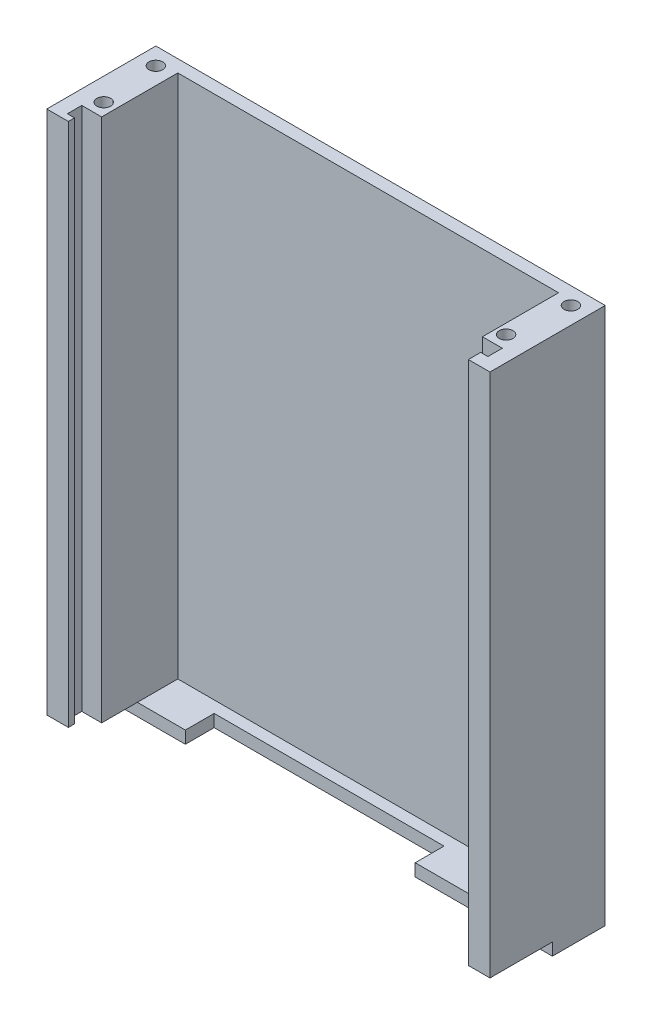
ISO-10303-21;
HEADER;
FILE_DESCRIPTION(('STEP AP214'),'2;1');
FILE_NAME('part.step','',(''),(''),'','','');
FILE_SCHEMA(('AUTOMOTIVE_DESIGN { 1 0 10303 214 1 1 1 1 }'));
ENDSEC;
DATA;
#1=APPLICATION_CONTEXT('core data for automotive mechanical design processes');
#2=APPLICATION_PROTOCOL_DEFINITION('international standard','automotive_design',2000,#1);
#3=PRODUCT_CONTEXT('',#1,'mechanical');
#4=PRODUCT('Part','Part','',(#3));
#5=PRODUCT_RELATED_PRODUCT_CATEGORY('part','',(#4));
#6=PRODUCT_DEFINITION_FORMATION('','',#4);
#7=PRODUCT_DEFINITION_CONTEXT('part definition',#1,'design');
#8=PRODUCT_DEFINITION('design','',#6,#7);
#9=PRODUCT_DEFINITION_SHAPE('','',#8);
#10=(LENGTH_UNIT() NAMED_UNIT(*) SI_UNIT(.MILLI.,.METRE.));
#11=(NAMED_UNIT(*) PLANE_ANGLE_UNIT() SI_UNIT($,.RADIAN.));
#12=(NAMED_UNIT(*) SI_UNIT($,.STERADIAN.) SOLID_ANGLE_UNIT());
#13=UNCERTAINTY_MEASURE_WITH_UNIT(LENGTH_MEASURE(1.E-05),#10,'distance_accuracy_value','');
#14=(GEOMETRIC_REPRESENTATION_CONTEXT(3) GLOBAL_UNCERTAINTY_ASSIGNED_CONTEXT((#13)) GLOBAL_UNIT_ASSIGNED_CONTEXT((#10,
#11,#12)) REPRESENTATION_CONTEXT('',''));
#15=CARTESIAN_POINT('',(0.,0.,0.));
#16=DIRECTION('',(0.,0.,1.));
#17=DIRECTION('',(1.,0.,0.));
#18=AXIS2_PLACEMENT_3D('',#15,#16,#17);
#19=CARTESIAN_POINT('',(0.,0.,0.));
#20=DIRECTION('',(0.,0.,1.));
#21=DIRECTION('',(1.,0.,0.));
#22=AXIS2_PLACEMENT_3D('',#19,#20,#21);
#23=PLANE('',#22);
#24=DIRECTION('',(0.,-1.,0.));
#25=VECTOR('',#24,1.);
#26=CARTESIAN_POINT('',(-54.2865384615385,7.1576923076923,0.));
#27=LINE('',#26,#25);
#28=CARTESIAN_POINT('',(-54.2865384615385,7.1576923076923,0.));
#29=VERTEX_POINT('',#28);
#30=CARTESIAN_POINT('',(-54.2865384615385,-15.8423076923077,0.));
#31=VERTEX_POINT('',#30);
#32=EDGE_CURVE('E214',#29,#31,#27,.T.);
#33=ORIENTED_EDGE('',*,*,#32,.F.);
#34=DIRECTION('',(1.,0.,0.));
#35=VECTOR('',#34,1.);
#36=CARTESIAN_POINT('',(-51.2865384615384,7.1576923076923,0.));
#37=LINE('',#36,#35);
#38=CARTESIAN_POINT('',(-62.1365384615385,7.1576923076923,0.));
#39=VERTEX_POINT('',#38);
#40=EDGE_CURVE('E218',#39,#29,#37,.T.);
#41=ORIENTED_EDGE('',*,*,#40,.F.);
#42=DIRECTION('',(0.,-1.,0.));
#43=VECTOR('',#42,1.);
#44=CARTESIAN_POINT('',(-62.1365384615385,7.1576923076923,0.));
#45=LINE('',#44,#43);
#46=CARTESIAN_POINT('',(-62.1365384615385,-15.8423076923077,0.));
#47=VERTEX_POINT('',#46);
#48=EDGE_CURVE('E643',#39,#47,#45,.T.);
#49=ORIENTED_EDGE('',*,*,#48,.T.);
#50=DIRECTION('',(-1.,0.,0.));
#51=VECTOR('',#50,1.);
#52=CARTESIAN_POINT('',(-51.2865384615384,-15.8423076923077,0.));
#53=LINE('',#52,#51);
#54=EDGE_CURVE('E220',#31,#47,#53,.T.);
#55=ORIENTED_EDGE('',*,*,#54,.F.);
#56=EDGE_LOOP('',(#33,#41,#49,#55));
#57=FACE_BOUND('',#56,.T.);
#58=DIRECTION('',(0.,-1.,0.));
#59=VECTOR('',#58,1.);
#60=CARTESIAN_POINT('',(-90.9615384615384,34.8076923076923,0.));
#61=LINE('',#60,#59);
#62=CARTESIAN_POINT('',(-90.9615384615384,34.8076923076923,0.));
#63=VERTEX_POINT('',#62);
#64=CARTESIAN_POINT('',(-90.9615384615384,-43.4923076923077,0.));
#65=VERTEX_POINT('',#64);
#66=EDGE_CURVE('E392',#63,#65,#61,.T.);
#67=ORIENTED_EDGE('',*,*,#66,.F.);
#68=DIRECTION('',(-1.,0.,0.));
#69=VECTOR('',#68,1.);
#70=CARTESIAN_POINT('',(-90.9615384615384,34.8076923076923,0.));
#71=LINE('',#70,#69);
#72=CARTESIAN_POINT('',(-25.4615384615384,34.8076923076923,0.));
#73=VERTEX_POINT('',#72);
#74=EDGE_CURVE('E396',#73,#63,#71,.T.);
#75=ORIENTED_EDGE('',*,*,#74,.F.);
#76=DIRECTION('',(0.,1.,0.));
#77=VECTOR('',#76,1.);
#78=CARTESIAN_POINT('',(-25.4615384615384,34.8076923076923,0.));
#79=LINE('',#78,#77);
#80=CARTESIAN_POINT('',(-25.4615384615384,-43.4923076923077,0.));
#81=VERTEX_POINT('',#80);
#82=EDGE_CURVE('E401',#81,#73,#79,.T.);
#83=ORIENTED_EDGE('',*,*,#82,.F.);
#84=DIRECTION('',(1.,0.,0.));
#85=VECTOR('',#84,1.);
#86=CARTESIAN_POINT('',(-90.9615384615384,-43.4923076923077,0.));
#87=LINE('',#86,#85);
#88=EDGE_CURVE('E250',#65,#81,#87,.T.);
#89=ORIENTED_EDGE('',*,*,#88,.F.);
#90=EDGE_LOOP('',(#67,#75,#83,#89));
#91=FACE_BOUND('',#90,.T.);
#92=ADVANCED_FACE('F33',(#57,#91),#23,.F.);
#93=CARTESIAN_POINT('',(-90.9615384615384,-41.6923076923077,1.8));
#94=DIRECTION('',(0.,1.,0.));
#95=DIRECTION('',(0.,0.,1.));
#96=AXIS2_PLACEMENT_3D('',#93,#94,#95);
#97=PLANE('',#96);
#98=CARTESIAN_POINT('',(-87.6615384615384,-41.6923076923077,10.9));
#99=DIRECTION('',(0.,-1.,0.));
#100=DIRECTION('',(0.,0.,-1.));
#101=AXIS2_PLACEMENT_3D('',#98,#99,#100);
#102=CIRCLE('',#101,0.999999999999998);
#103=CARTESIAN_POINT('',(-87.6615384615384,-41.6923076923077,9.9));
#104=VERTEX_POINT('',#103);
#105=EDGE_CURVE('E635',#104,#104,#102,.T.);
#106=ORIENTED_EDGE('',*,*,#105,.F.);
#107=EDGE_LOOP('',(#106));
#108=FACE_BOUND('',#107,.T.);
#109=DIRECTION('',(-1.,0.,0.));
#110=VECTOR('',#109,1.);
#111=CARTESIAN_POINT('',(-85.9615384615384,-41.6923076923077,7.7));
#112=LINE('',#111,#110);
#113=CARTESIAN_POINT('',(-85.9615384615384,-41.6923076923077,7.7));
#114=VERTEX_POINT('',#113);
#115=CARTESIAN_POINT('',(-90.9615384615384,-41.6923076923077,7.7));
#116=VERTEX_POINT('',#115);
#117=EDGE_CURVE('E11',#114,#116,#112,.T.);
#118=ORIENTED_EDGE('',*,*,#117,.F.);
#119=DIRECTION('',(0.,0.,-1.));
#120=VECTOR('',#119,1.);
#121=CARTESIAN_POINT('',(-85.9615384615384,-41.6923076923077,16.8));
#122=LINE('',#121,#120);
#123=CARTESIAN_POINT('',(-85.9615384615384,-41.6923076923077,12.9));
#124=VERTEX_POINT('',#123);
#125=EDGE_CURVE('E389',#124,#114,#122,.T.);
#126=ORIENTED_EDGE('',*,*,#125,.F.);
#127=DIRECTION('',(1.,0.,0.));
#128=VECTOR('',#127,1.);
#129=CARTESIAN_POINT('',(-88.8615384615384,-41.6923076923077,12.9));
#130=LINE('',#129,#128);
#131=CARTESIAN_POINT('',(-88.8615384615384,-41.6923076923077,12.9));
#132=VERTEX_POINT('',#131);
#133=EDGE_CURVE('E296',#132,#124,#130,.T.);
#134=ORIENTED_EDGE('',*,*,#133,.F.);
#135=DIRECTION('',(0.,0.,-1.));
#136=VECTOR('',#135,1.);
#137=CARTESIAN_POINT('',(-88.8615384615384,-41.6923076923077,12.9));
#138=LINE('',#137,#136);
#139=CARTESIAN_POINT('',(-88.8615384615384,-41.6923076923077,15.));
#140=VERTEX_POINT('',#139);
#141=EDGE_CURVE('E319',#140,#132,#138,.T.);
#142=ORIENTED_EDGE('',*,*,#141,.F.);
#143=DIRECTION('',(-1.,0.,0.));
#144=VECTOR('',#143,1.);
#145=CARTESIAN_POINT('',(-88.8615384615384,-41.6923076923077,15.));
#146=LINE('',#145,#144);
#147=CARTESIAN_POINT('',(-87.8115384615384,-41.6923076923077,15.));
#148=VERTEX_POINT('',#147);
#149=EDGE_CURVE('E316',#148,#140,#146,.T.);
#150=ORIENTED_EDGE('',*,*,#149,.F.);
#151=DIRECTION('',(0.,0.,-1.));
#152=VECTOR('',#151,1.);
#153=CARTESIAN_POINT('',(-87.8115384615384,-41.6923076923077,15.9));
#154=LINE('',#153,#152);
#155=CARTESIAN_POINT('',(-87.8115384615384,-41.6923076923077,15.9));
#156=VERTEX_POINT('',#155);
#157=EDGE_CURVE('E312',#156,#148,#154,.T.);
#158=ORIENTED_EDGE('',*,*,#157,.F.);
#159=DIRECTION('',(1.,0.,0.));
#160=VECTOR('',#159,1.);
#161=CARTESIAN_POINT('',(-89.1115384615384,-41.6923076923077,15.9));
#162=LINE('',#161,#160);
#163=CARTESIAN_POINT('',(-90.9615384615384,-41.6923076923077,15.9));
#164=VERTEX_POINT('',#163);
#165=EDGE_CURVE('E309',#164,#156,#162,.T.);
#166=ORIENTED_EDGE('',*,*,#165,.F.);
#167=DIRECTION('',(0.,0.,-1.));
#168=VECTOR('',#167,1.);
#169=CARTESIAN_POINT('',(-90.9615384615384,-41.6923076923077,1.8));
#170=LINE('',#169,#168);
#171=EDGE_CURVE('E37',#164,#116,#170,.T.);
#172=ORIENTED_EDGE('',*,*,#171,.T.);
#173=EDGE_LOOP('',(#118,#126,#134,#142,#150,#158,#166,#172));
#174=FACE_BOUND('',#173,.T.);
#175=ADVANCED_FACE('F460',(#108,#174),#97,.F.);
#176=CARTESIAN_POINT('',(-29.0115384615384,-41.6923076923077,10.9));
#177=DIRECTION('',(0.,-1.,0.));
#178=DIRECTION('',(0.,0.,-1.));
#179=AXIS2_PLACEMENT_3D('',#176,#177,#178);
#180=CIRCLE('',#179,1.);
#181=CARTESIAN_POINT('',(-29.0115384615384,-41.6923076923077,9.9));
#182=VERTEX_POINT('',#181);
#183=EDGE_CURVE('E625',#182,#182,#180,.T.);
#184=ORIENTED_EDGE('',*,*,#183,.F.);
#185=EDGE_LOOP('',(#184));
#186=FACE_BOUND('',#185,.T.);
#187=DIRECTION('',(-1.,0.,0.));
#188=VECTOR('',#187,1.);
#189=CARTESIAN_POINT('',(-30.4615384615384,-41.6923076923077,7.7));
#190=LINE('',#189,#188);
#191=CARTESIAN_POINT('',(-25.4615384615384,-41.6923076923077,7.69999999999999));
#192=VERTEX_POINT('',#191);
#193=CARTESIAN_POINT('',(-30.4615384615384,-41.6923076923077,7.7));
#194=VERTEX_POINT('',#193);
#195=EDGE_CURVE('E50',#192,#194,#190,.T.);
#196=ORIENTED_EDGE('',*,*,#195,.F.);
#197=DIRECTION('',(0.,0.,-1.));
#198=VECTOR('',#197,1.);
#199=CARTESIAN_POINT('',(-25.4615384615384,-41.6923076923077,1.8));
#200=LINE('',#199,#198);
#201=CARTESIAN_POINT('',(-25.4615384615384,-41.6923076923077,16.8));
#202=VERTEX_POINT('',#201);
#203=EDGE_CURVE('E408',#202,#192,#200,.T.);
#204=ORIENTED_EDGE('',*,*,#203,.F.);
#205=DIRECTION('',(1.,0.,0.));
#206=VECTOR('',#205,1.);
#207=CARTESIAN_POINT('',(-25.4615384615384,-41.6923076923077,16.8));
#208=LINE('',#207,#206);
#209=CARTESIAN_POINT('',(-28.6115384615384,-41.6923076923077,16.8));
#210=VERTEX_POINT('',#209);
#211=EDGE_CURVE('E374',#210,#202,#208,.T.);
#212=ORIENTED_EDGE('',*,*,#211,.F.);
#213=DIRECTION('',(0.,0.,1.));
#214=VECTOR('',#213,1.);
#215=CARTESIAN_POINT('',(-28.6115384615384,-41.6923076923077,15.9));
#216=LINE('',#215,#214);
#217=CARTESIAN_POINT('',(-28.6115384615384,-41.6923076923077,15.));
#218=VERTEX_POINT('',#217);
#219=EDGE_CURVE('E352',#218,#210,#216,.T.);
#220=ORIENTED_EDGE('',*,*,#219,.F.);
#221=DIRECTION('',(-1.,0.,0.));
#222=VECTOR('',#221,1.);
#223=CARTESIAN_POINT('',(-28.6115384615384,-41.6923076923077,15.));
#224=LINE('',#223,#222);
#225=CARTESIAN_POINT('',(-27.5615384615384,-41.6923076923077,15.));
#226=VERTEX_POINT('',#225);
#227=EDGE_CURVE('E291',#226,#218,#224,.T.);
#228=ORIENTED_EDGE('',*,*,#227,.F.);
#229=DIRECTION('',(0.,0.,1.));
#230=VECTOR('',#229,1.);
#231=CARTESIAN_POINT('',(-27.5615384615384,-41.6923076923077,15.));
#232=LINE('',#231,#230);
#233=CARTESIAN_POINT('',(-27.5615384615384,-41.6923076923077,12.9));
#234=VERTEX_POINT('',#233);
#235=EDGE_CURVE('E340',#234,#226,#232,.T.);
#236=ORIENTED_EDGE('',*,*,#235,.F.);
#237=DIRECTION('',(1.,0.,0.));
#238=VECTOR('',#237,1.);
#239=CARTESIAN_POINT('',(-27.5615384615384,-41.6923076923077,12.9));
#240=LINE('',#239,#238);
#241=CARTESIAN_POINT('',(-30.4615384615384,-41.6923076923077,12.9));
#242=VERTEX_POINT('',#241);
#243=EDGE_CURVE('E354',#242,#234,#240,.T.);
#244=ORIENTED_EDGE('',*,*,#243,.F.);
#245=DIRECTION('',(0.,0.,-1.));
#246=VECTOR('',#245,1.);
#247=CARTESIAN_POINT('',(-30.4615384615384,-41.6923076923077,16.8));
#248=LINE('',#247,#246);
#249=EDGE_CURVE('E379',#242,#194,#248,.T.);
#250=ORIENTED_EDGE('',*,*,#249,.T.);
#251=EDGE_LOOP('',(#196,#204,#212,#220,#228,#236,#244,#250));
#252=FACE_BOUND('',#251,.T.);
#253=ADVANCED_FACE('F462',(#186,#252),#97,.F.);
#254=CARTESIAN_POINT('',(0.,0.,1.8));
#255=DIRECTION('',(0.,0.,1.));
#256=DIRECTION('',(1.,0.,0.));
#257=AXIS2_PLACEMENT_3D('',#254,#255,#256);
#258=PLANE('',#257);
#259=DIRECTION('',(1.,0.,0.));
#260=VECTOR('',#259,1.);
#261=CARTESIAN_POINT('',(-90.9615384615384,-41.6923076923077,1.8));
#262=LINE('',#261,#260);
#263=CARTESIAN_POINT('',(-85.9615384615384,-41.6923076923077,1.8));
#264=VERTEX_POINT('',#263);
#265=CARTESIAN_POINT('',(-30.4615384615384,-41.6923076923077,1.8));
#266=VERTEX_POINT('',#265);
#267=EDGE_CURVE('E393',#264,#266,#262,.T.);
#268=ORIENTED_EDGE('',*,*,#267,.T.);
#269=DIRECTION('',(0.,-1.,0.));
#270=VECTOR('',#269,1.);
#271=CARTESIAN_POINT('',(-30.4615384615384,34.8076923076923,1.8));
#272=LINE('',#271,#270);
#273=CARTESIAN_POINT('',(-30.4615384615384,34.8076923076923,1.8));
#274=VERTEX_POINT('',#273);
#275=EDGE_CURVE('E326',#274,#266,#272,.T.);
#276=ORIENTED_EDGE('',*,*,#275,.F.);
#277=DIRECTION('',(-1.,0.,0.));
#278=VECTOR('',#277,1.);
#279=CARTESIAN_POINT('',(-90.9615384615384,34.8076923076923,1.8));
#280=LINE('',#279,#278);
#281=CARTESIAN_POINT('',(-85.9615384615384,34.8076923076923,1.8));
#282=VERTEX_POINT('',#281);
#283=EDGE_CURVE('E395',#274,#282,#280,.T.);
#284=ORIENTED_EDGE('',*,*,#283,.T.);
#285=DIRECTION('',(0.,1.,0.));
#286=VECTOR('',#285,1.);
#287=CARTESIAN_POINT('',(-85.9615384615384,34.8076923076923,1.8));
#288=LINE('',#287,#286);
#289=EDGE_CURVE('E383',#264,#282,#288,.T.);
#290=ORIENTED_EDGE('',*,*,#289,.F.);
#291=EDGE_LOOP('',(#268,#276,#284,#290));
#292=FACE_BOUND('',#291,.T.);
#293=ADVANCED_FACE('F468',(#292),#258,.T.);
#294=CARTESIAN_POINT('',(-90.9615384615384,34.8076923076923,1.8));
#295=DIRECTION('',(1.,0.,0.));
#296=DIRECTION('',(0.,1.,0.));
#297=AXIS2_PLACEMENT_3D('',#294,#295,#296);
#298=PLANE('',#297);
#299=ORIENTED_EDGE('',*,*,#171,.F.);
#300=DIRECTION('',(0.,-1.,0.));
#301=VECTOR('',#300,1.);
#302=CARTESIAN_POINT('',(-90.9615384615384,34.8076923076923,15.9));
#303=LINE('',#302,#301);
#304=CARTESIAN_POINT('',(-90.9615384615384,34.8076923076923,15.9));
#305=VERTEX_POINT('',#304);
#306=EDGE_CURVE('E308',#305,#164,#303,.T.);
#307=ORIENTED_EDGE('',*,*,#306,.F.);
#308=DIRECTION('',(0.,0.,-1.));
#309=VECTOR('',#308,1.);
#310=CARTESIAN_POINT('',(-90.9615384615384,34.8076923076923,1.8));
#311=LINE('',#310,#309);
#312=EDGE_CURVE('E399',#305,#63,#311,.T.);
#313=ORIENTED_EDGE('',*,*,#312,.T.);
#314=ORIENTED_EDGE('',*,*,#66,.T.);
#315=DIRECTION('',(0.,0.,-1.));
#316=VECTOR('',#315,1.);
#317=CARTESIAN_POINT('',(-90.9615384615384,-43.4923076923077,7.7));
#318=LINE('',#317,#316);
#319=CARTESIAN_POINT('',(-90.9615384615384,-43.4923076923077,7.7));
#320=VERTEX_POINT('',#319);
#321=EDGE_CURVE('E247',#320,#65,#318,.T.);
#322=ORIENTED_EDGE('',*,*,#321,.F.);
#323=DIRECTION('',(0.,1.,0.));
#324=VECTOR('',#323,1.);
#325=CARTESIAN_POINT('',(-90.9615384615384,-43.4923076923077,7.7));
#326=LINE('',#325,#324);
#327=EDGE_CURVE('E288',#320,#116,#326,.T.);
#328=ORIENTED_EDGE('',*,*,#327,.T.);
#329=EDGE_LOOP('',(#299,#307,#313,#314,#322,#328));
#330=FACE_BOUND('',#329,.T.);
#331=ADVANCED_FACE('F35',(#330),#298,.F.);
#332=CARTESIAN_POINT('',(-25.4615384615384,34.8076923076923,1.8));
#333=DIRECTION('',(-1.,0.,0.));
#334=DIRECTION('',(0.,-1.,0.));
#335=AXIS2_PLACEMENT_3D('',#332,#333,#334);
#336=PLANE('',#335);
#337=ORIENTED_EDGE('',*,*,#82,.T.);
#338=DIRECTION('',(0.,0.,-1.));
#339=VECTOR('',#338,1.);
#340=CARTESIAN_POINT('',(-25.4615384615384,34.8076923076923,1.8));
#341=LINE('',#340,#339);
#342=CARTESIAN_POINT('',(-25.4615384615384,34.8076923076923,16.8));
#343=VERTEX_POINT('',#342);
#344=EDGE_CURVE('E406',#343,#73,#341,.T.);
#345=ORIENTED_EDGE('',*,*,#344,.F.);
#346=DIRECTION('',(0.,1.,0.));
#347=VECTOR('',#346,1.);
#348=CARTESIAN_POINT('',(-25.4615384615384,34.8076923076923,16.8));
#349=LINE('',#348,#347);
#350=EDGE_CURVE('E368',#202,#343,#349,.T.);
#351=ORIENTED_EDGE('',*,*,#350,.F.);
#352=ORIENTED_EDGE('',*,*,#203,.T.);
#353=DIRECTION('',(0.,1.,0.));
#354=VECTOR('',#353,1.);
#355=CARTESIAN_POINT('',(-25.4615384615384,-43.4923076923077,7.7));
#356=LINE('',#355,#354);
#357=CARTESIAN_POINT('',(-25.4615384615384,-43.4923076923077,7.7));
#358=VERTEX_POINT('',#357);
#359=EDGE_CURVE('E285',#358,#192,#356,.T.);
#360=ORIENTED_EDGE('',*,*,#359,.F.);
#361=DIRECTION('',(0.,0.,1.));
#362=VECTOR('',#361,1.);
#363=CARTESIAN_POINT('',(-25.4615384615384,-43.4923076923077,0.));
#364=LINE('',#363,#362);
#365=EDGE_CURVE('E253',#81,#358,#364,.T.);
#366=ORIENTED_EDGE('',*,*,#365,.F.);
#367=EDGE_LOOP('',(#337,#345,#351,#352,#360,#366));
#368=FACE_BOUND('',#367,.T.);
#369=ADVANCED_FACE('F412',(#368),#336,.F.);
#370=CARTESIAN_POINT('',(-90.9615384615384,34.8076923076923,1.8));
#371=DIRECTION('',(0.,-1.,0.));
#372=DIRECTION('',(0.,0.,-1.));
#373=AXIS2_PLACEMENT_3D('',#370,#371,#372);
#374=PLANE('',#373);
#375=CARTESIAN_POINT('',(-27.9615384615384,34.8076923076923,2.5));
#376=DIRECTION('',(0.,1.,0.));
#377=DIRECTION('',(0.,0.,1.));
#378=AXIS2_PLACEMENT_3D('',#375,#376,#377);
#379=CIRCLE('',#378,1.);
#380=CARTESIAN_POINT('',(-27.9615384615384,34.8076923076923,3.5));
#381=VERTEX_POINT('',#380);
#382=EDGE_CURVE('E608',#381,#381,#379,.T.);
#383=ORIENTED_EDGE('',*,*,#382,.F.);
#384=EDGE_LOOP('',(#383));
#385=FACE_BOUND('',#384,.T.);
#386=CARTESIAN_POINT('',(-88.4615384615384,34.8076923076923,2.5));
#387=DIRECTION('',(0.,1.,0.));
#388=DIRECTION('',(0.,0.,1.));
#389=AXIS2_PLACEMENT_3D('',#386,#387,#388);
#390=CIRCLE('',#389,0.999999999999998);
#391=CARTESIAN_POINT('',(-88.4615384615384,34.8076923076923,3.5));
#392=VERTEX_POINT('',#391);
#393=EDGE_CURVE('E619',#392,#392,#390,.T.);
#394=ORIENTED_EDGE('',*,*,#393,.F.);
#395=EDGE_LOOP('',(#394));
#396=FACE_BOUND('',#395,.T.);
#397=CARTESIAN_POINT('',(-29.0115384615384,34.8076923076923,10.9));
#398=DIRECTION('',(0.,1.,0.));
#399=DIRECTION('',(0.,0.,1.));
#400=AXIS2_PLACEMENT_3D('',#397,#398,#399);
#401=CIRCLE('',#400,1.);
#402=CARTESIAN_POINT('',(-29.0115384615384,34.8076923076923,11.9));
#403=VERTEX_POINT('',#402);
#404=EDGE_CURVE('E626',#403,#403,#401,.T.);
#405=ORIENTED_EDGE('',*,*,#404,.F.);
#406=EDGE_LOOP('',(#405));
#407=FACE_BOUND('',#406,.T.);
#408=CARTESIAN_POINT('',(-87.6615384615384,34.8076923076923,10.9));
#409=DIRECTION('',(0.,1.,0.));
#410=DIRECTION('',(0.,0.,1.));
#411=AXIS2_PLACEMENT_3D('',#408,#409,#410);
#412=CIRCLE('',#411,0.999999999999998);
#413=CARTESIAN_POINT('',(-87.6615384615384,34.8076923076923,11.9));
#414=VERTEX_POINT('',#413);
#415=EDGE_CURVE('E607',#414,#414,#412,.T.);
#416=ORIENTED_EDGE('',*,*,#415,.F.);
#417=EDGE_LOOP('',(#416));
#418=FACE_BOUND('',#417,.T.);
#419=DIRECTION('',(0.,0.,-1.));
#420=VECTOR('',#419,1.);
#421=CARTESIAN_POINT('',(-88.8615384615384,34.8076923076923,12.9));
#422=LINE('',#421,#420);
#423=CARTESIAN_POINT('',(-88.8615384615384,34.8076923076923,15.));
#424=VERTEX_POINT('',#423);
#425=CARTESIAN_POINT('',(-88.8615384615384,34.8076923076923,12.9));
#426=VERTEX_POINT('',#425);
#427=EDGE_CURVE('E302',#424,#426,#422,.T.);
#428=ORIENTED_EDGE('',*,*,#427,.T.);
#429=DIRECTION('',(1.,0.,0.));
#430=VECTOR('',#429,1.);
#431=CARTESIAN_POINT('',(-88.8615384615384,34.8076923076923,12.9));
#432=LINE('',#431,#430);
#433=CARTESIAN_POINT('',(-85.9615384615384,34.8076923076923,12.9));
#434=VERTEX_POINT('',#433);
#435=EDGE_CURVE('E305',#426,#434,#432,.T.);
#436=ORIENTED_EDGE('',*,*,#435,.T.);
#437=DIRECTION('',(0.,0.,-1.));
#438=VECTOR('',#437,1.);
#439=CARTESIAN_POINT('',(-85.9615384615384,34.8076923076923,16.8));
#440=LINE('',#439,#438);
#441=EDGE_CURVE('E386',#434,#282,#440,.T.);
#442=ORIENTED_EDGE('',*,*,#441,.T.);
#443=ORIENTED_EDGE('',*,*,#283,.F.);
#444=DIRECTION('',(0.,0.,-1.));
#445=VECTOR('',#444,1.);
#446=CARTESIAN_POINT('',(-30.4615384615384,34.8076923076923,16.8));
#447=LINE('',#446,#445);
#448=CARTESIAN_POINT('',(-30.4615384615384,34.8076923076923,12.9));
#449=VERTEX_POINT('',#448);
#450=EDGE_CURVE('E381',#449,#274,#447,.T.);
#451=ORIENTED_EDGE('',*,*,#450,.F.);
#452=DIRECTION('',(1.,0.,0.));
#453=VECTOR('',#452,1.);
#454=CARTESIAN_POINT('',(-27.5615384615384,34.8076923076923,12.9));
#455=LINE('',#454,#453);
#456=CARTESIAN_POINT('',(-27.5615384615384,34.8076923076923,12.9));
#457=VERTEX_POINT('',#456);
#458=EDGE_CURVE('E343',#449,#457,#455,.T.);
#459=ORIENTED_EDGE('',*,*,#458,.T.);
#460=DIRECTION('',(0.,0.,1.));
#461=VECTOR('',#460,1.);
#462=CARTESIAN_POINT('',(-27.5615384615384,34.8076923076923,15.));
#463=LINE('',#462,#461);
#464=CARTESIAN_POINT('',(-27.5615384615384,34.8076923076923,15.));
#465=VERTEX_POINT('',#464);
#466=EDGE_CURVE('E346',#457,#465,#463,.T.);
#467=ORIENTED_EDGE('',*,*,#466,.T.);
#468=DIRECTION('',(-1.,0.,0.));
#469=VECTOR('',#468,1.);
#470=CARTESIAN_POINT('',(-28.6115384615384,34.8076923076923,15.));
#471=LINE('',#470,#469);
#472=CARTESIAN_POINT('',(-28.6115384615384,34.8076923076923,15.));
#473=VERTEX_POINT('',#472);
#474=EDGE_CURVE('E336',#465,#473,#471,.T.);
#475=ORIENTED_EDGE('',*,*,#474,.T.);
#476=DIRECTION('',(0.,0.,1.));
#477=VECTOR('',#476,1.);
#478=CARTESIAN_POINT('',(-28.6115384615384,34.8076923076923,15.9));
#479=LINE('',#478,#477);
#480=CARTESIAN_POINT('',(-28.6115384615384,34.8076923076923,16.8));
#481=VERTEX_POINT('',#480);
#482=EDGE_CURVE('E339',#473,#481,#479,.T.);
#483=ORIENTED_EDGE('',*,*,#482,.T.);
#484=DIRECTION('',(-1.,0.,0.));
#485=VECTOR('',#484,1.);
#486=CARTESIAN_POINT('',(-25.4615384615384,34.8076923076923,16.8));
#487=LINE('',#486,#485);
#488=EDGE_CURVE('E371',#343,#481,#487,.T.);
#489=ORIENTED_EDGE('',*,*,#488,.F.);
#490=ORIENTED_EDGE('',*,*,#344,.T.);
#491=ORIENTED_EDGE('',*,*,#74,.T.);
#492=ORIENTED_EDGE('',*,*,#312,.F.);
#493=DIRECTION('',(1.,0.,0.));
#494=VECTOR('',#493,1.);
#495=CARTESIAN_POINT('',(-90.9615384615384,34.8076923076923,15.9));
#496=LINE('',#495,#494);
#497=CARTESIAN_POINT('',(-87.8115384615384,34.8076923076923,15.9));
#498=VERTEX_POINT('',#497);
#499=EDGE_CURVE('E292',#305,#498,#496,.T.);
#500=ORIENTED_EDGE('',*,*,#499,.T.);
#501=DIRECTION('',(0.,0.,-1.));
#502=VECTOR('',#501,1.);
#503=CARTESIAN_POINT('',(-87.8115384615384,34.8076923076923,15.9));
#504=LINE('',#503,#502);
#505=CARTESIAN_POINT('',(-87.8115384615384,34.8076923076923,15.));
#506=VERTEX_POINT('',#505);
#507=EDGE_CURVE('E295',#498,#506,#504,.T.);
#508=ORIENTED_EDGE('',*,*,#507,.T.);
#509=DIRECTION('',(-1.,0.,0.));
#510=VECTOR('',#509,1.);
#511=CARTESIAN_POINT('',(-87.8115384615384,34.8076923076923,15.));
#512=LINE('',#511,#510);
#513=EDGE_CURVE('E299',#506,#424,#512,.T.);
#514=ORIENTED_EDGE('',*,*,#513,.T.);
#515=EDGE_LOOP('',(#428,#436,#442,#443,#451,#459,#467,#475,#483,#489,#490,#491,#492,#500,#508,#514));
#516=FACE_BOUND('',#515,.T.);
#517=ADVANCED_FACE('F427',(#385,#396,#407,#418,#516),#374,.F.);
#518=CARTESIAN_POINT('',(-85.9615384615384,34.8076923076923,16.8));
#519=DIRECTION('',(-1.,0.,0.));
#520=DIRECTION('',(0.,-1.,0.));
#521=AXIS2_PLACEMENT_3D('',#518,#519,#520);
#522=PLANE('',#521);
#523=ORIENTED_EDGE('',*,*,#441,.F.);
#524=DIRECTION('',(0.,-1.,0.));
#525=VECTOR('',#524,1.);
#526=CARTESIAN_POINT('',(-85.9615384615384,34.8076923076923,12.9));
#527=LINE('',#526,#525);
#528=EDGE_CURVE('E323',#434,#124,#527,.T.);
#529=ORIENTED_EDGE('',*,*,#528,.T.);
#530=ORIENTED_EDGE('',*,*,#125,.T.);
#531=EDGE_CURVE('E388',#114,#264,#122,.T.);
#532=ORIENTED_EDGE('',*,*,#531,.T.);
#533=ORIENTED_EDGE('',*,*,#289,.T.);
#534=EDGE_LOOP('',(#523,#529,#530,#532,#533));
#535=FACE_BOUND('',#534,.T.);
#536=ADVANCED_FACE('F458',(#535),#522,.F.);
#537=CARTESIAN_POINT('',(-30.4615384615384,34.8076923076923,16.8));
#538=DIRECTION('',(1.,0.,0.));
#539=DIRECTION('',(0.,1.,0.));
#540=AXIS2_PLACEMENT_3D('',#537,#538,#539);
#541=PLANE('',#540);
#542=ORIENTED_EDGE('',*,*,#249,.F.);
#543=DIRECTION('',(0.,-1.,0.));
#544=VECTOR('',#543,1.);
#545=CARTESIAN_POINT('',(-30.4615384615384,34.8076923076923,12.9));
#546=LINE('',#545,#544);
#547=EDGE_CURVE('E362',#449,#242,#546,.T.);
#548=ORIENTED_EDGE('',*,*,#547,.F.);
#549=ORIENTED_EDGE('',*,*,#450,.T.);
#550=ORIENTED_EDGE('',*,*,#275,.T.);
#551=EDGE_CURVE('E376',#194,#266,#248,.T.);
#552=ORIENTED_EDGE('',*,*,#551,.F.);
#553=EDGE_LOOP('',(#542,#548,#549,#550,#552));
#554=FACE_BOUND('',#553,.T.);
#555=ADVANCED_FACE('F483',(#554),#541,.F.);
#556=CARTESIAN_POINT('',(0.,0.,16.8));
#557=DIRECTION('',(0.,0.,-1.));
#558=DIRECTION('',(-1.,0.,0.));
#559=AXIS2_PLACEMENT_3D('',#556,#557,#558);
#560=PLANE('',#559);
#561=ORIENTED_EDGE('',*,*,#488,.T.);
#562=DIRECTION('',(0.,-1.,0.));
#563=VECTOR('',#562,1.);
#564=CARTESIAN_POINT('',(-28.6115384615384,34.8076923076923,16.8));
#565=LINE('',#564,#563);
#566=EDGE_CURVE('E364',#481,#210,#565,.T.);
#567=ORIENTED_EDGE('',*,*,#566,.T.);
#568=ORIENTED_EDGE('',*,*,#211,.T.);
#569=ORIENTED_EDGE('',*,*,#350,.T.);
#570=EDGE_LOOP('',(#561,#567,#568,#569));
#571=FACE_BOUND('',#570,.T.);
#572=ADVANCED_FACE('F486',(#571),#560,.F.);
#573=CARTESIAN_POINT('',(-28.6115384615384,34.8076923076923,15.));
#574=DIRECTION('',(0.,0.,1.));
#575=DIRECTION('',(1.,0.,0.));
#576=AXIS2_PLACEMENT_3D('',#573,#574,#575);
#577=PLANE('',#576);
#578=ORIENTED_EDGE('',*,*,#227,.T.);
#579=DIRECTION('',(0.,-1.,0.));
#580=VECTOR('',#579,1.);
#581=CARTESIAN_POINT('',(-28.6115384615384,34.8076923076923,15.));
#582=LINE('',#581,#580);
#583=EDGE_CURVE('E349',#473,#218,#582,.T.);
#584=ORIENTED_EDGE('',*,*,#583,.F.);
#585=ORIENTED_EDGE('',*,*,#474,.F.);
#586=DIRECTION('',(0.,-1.,0.));
#587=VECTOR('',#586,1.);
#588=CARTESIAN_POINT('',(-27.5615384615384,34.8076923076923,15.));
#589=LINE('',#588,#587);
#590=EDGE_CURVE('E313',#465,#226,#589,.T.);
#591=ORIENTED_EDGE('',*,*,#590,.T.);
#592=EDGE_LOOP('',(#578,#584,#585,#591));
#593=FACE_BOUND('',#592,.T.);
#594=ADVANCED_FACE('F490',(#593),#577,.F.);
#595=CARTESIAN_POINT('',(-27.5615384615384,34.8076923076923,15.));
#596=DIRECTION('',(1.,0.,0.));
#597=DIRECTION('',(0.,0.,-1.));
#598=AXIS2_PLACEMENT_3D('',#595,#596,#597);
#599=PLANE('',#598);
#600=ORIENTED_EDGE('',*,*,#235,.T.);
#601=ORIENTED_EDGE('',*,*,#590,.F.);
#602=ORIENTED_EDGE('',*,*,#466,.F.);
#603=DIRECTION('',(0.,-1.,0.));
#604=VECTOR('',#603,1.);
#605=CARTESIAN_POINT('',(-27.5615384615384,34.8076923076923,12.9));
#606=LINE('',#605,#604);
#607=EDGE_CURVE('E360',#457,#234,#606,.T.);
#608=ORIENTED_EDGE('',*,*,#607,.T.);
#609=EDGE_LOOP('',(#600,#601,#602,#608));
#610=FACE_BOUND('',#609,.T.);
#611=ADVANCED_FACE('F494',(#610),#599,.F.);
#612=CARTESIAN_POINT('',(-27.5615384615384,34.8076923076923,12.9));
#613=DIRECTION('',(0.,0.,-1.));
#614=DIRECTION('',(-1.,0.,0.));
#615=AXIS2_PLACEMENT_3D('',#612,#613,#614);
#616=PLANE('',#615);
#617=ORIENTED_EDGE('',*,*,#243,.T.);
#618=ORIENTED_EDGE('',*,*,#607,.F.);
#619=ORIENTED_EDGE('',*,*,#458,.F.);
#620=ORIENTED_EDGE('',*,*,#547,.T.);
#621=EDGE_LOOP('',(#617,#618,#619,#620));
#622=FACE_BOUND('',#621,.T.);
#623=ADVANCED_FACE('F499',(#622),#616,.F.);
#624=CARTESIAN_POINT('',(-28.6115384615384,34.8076923076923,15.9));
#625=DIRECTION('',(1.,0.,0.));
#626=DIRECTION('',(0.,0.,-1.));
#627=AXIS2_PLACEMENT_3D('',#624,#625,#626);
#628=PLANE('',#627);
#629=ORIENTED_EDGE('',*,*,#219,.T.);
#630=ORIENTED_EDGE('',*,*,#566,.F.);
#631=ORIENTED_EDGE('',*,*,#482,.F.);
#632=ORIENTED_EDGE('',*,*,#583,.T.);
#633=EDGE_LOOP('',(#629,#630,#631,#632));
#634=FACE_BOUND('',#633,.T.);
#635=ADVANCED_FACE('F496',(#634),#628,.F.);
#636=CARTESIAN_POINT('',(-88.8615384615384,34.8076923076923,12.9));
#637=DIRECTION('',(0.,0.,-1.));
#638=DIRECTION('',(-1.,0.,0.));
#639=AXIS2_PLACEMENT_3D('',#636,#637,#638);
#640=PLANE('',#639);
#641=ORIENTED_EDGE('',*,*,#133,.T.);
#642=ORIENTED_EDGE('',*,*,#528,.F.);
#643=ORIENTED_EDGE('',*,*,#435,.F.);
#644=DIRECTION('',(0.,-1.,0.));
#645=VECTOR('',#644,1.);
#646=CARTESIAN_POINT('',(-88.8615384615384,34.8076923076923,12.9));
#647=LINE('',#646,#645);
#648=EDGE_CURVE('E327',#426,#132,#647,.T.);
#649=ORIENTED_EDGE('',*,*,#648,.T.);
#650=EDGE_LOOP('',(#641,#642,#643,#649));
#651=FACE_BOUND('',#650,.T.);
#652=ADVANCED_FACE('F455',(#651),#640,.F.);
#653=CARTESIAN_POINT('',(-88.8615384615384,34.8076923076923,12.9));
#654=DIRECTION('',(-1.,0.,0.));
#655=DIRECTION('',(0.,0.,1.));
#656=AXIS2_PLACEMENT_3D('',#653,#654,#655);
#657=PLANE('',#656);
#658=ORIENTED_EDGE('',*,*,#141,.T.);
#659=ORIENTED_EDGE('',*,*,#648,.F.);
#660=ORIENTED_EDGE('',*,*,#427,.F.);
#661=DIRECTION('',(0.,-1.,0.));
#662=VECTOR('',#661,1.);
#663=CARTESIAN_POINT('',(-88.8615384615384,34.8076923076923,15.));
#664=LINE('',#663,#662);
#665=EDGE_CURVE('E329',#424,#140,#664,.T.);
#666=ORIENTED_EDGE('',*,*,#665,.T.);
#667=EDGE_LOOP('',(#658,#659,#660,#666));
#668=FACE_BOUND('',#667,.T.);
#669=ADVANCED_FACE('F451',(#668),#657,.F.);
#670=CARTESIAN_POINT('',(-88.8615384615384,34.8076923076923,15.));
#671=DIRECTION('',(0.,0.,1.));
#672=DIRECTION('',(1.,0.,0.));
#673=AXIS2_PLACEMENT_3D('',#670,#671,#672);
#674=PLANE('',#673);
#675=ORIENTED_EDGE('',*,*,#149,.T.);
#676=ORIENTED_EDGE('',*,*,#665,.F.);
#677=ORIENTED_EDGE('',*,*,#513,.F.);
#678=DIRECTION('',(0.,-1.,0.));
#679=VECTOR('',#678,1.);
#680=CARTESIAN_POINT('',(-87.8115384615384,34.8076923076923,15.));
#681=LINE('',#680,#679);
#682=EDGE_CURVE('E331',#506,#148,#681,.T.);
#683=ORIENTED_EDGE('',*,*,#682,.T.);
#684=EDGE_LOOP('',(#675,#676,#677,#683));
#685=FACE_BOUND('',#684,.T.);
#686=ADVANCED_FACE('F446',(#685),#674,.F.);
#687=CARTESIAN_POINT('',(-87.8115384615384,34.8076923076923,15.9));
#688=DIRECTION('',(-1.,0.,0.));
#689=DIRECTION('',(0.,0.,1.));
#690=AXIS2_PLACEMENT_3D('',#687,#688,#689);
#691=PLANE('',#690);
#692=ORIENTED_EDGE('',*,*,#157,.T.);
#693=ORIENTED_EDGE('',*,*,#682,.F.);
#694=ORIENTED_EDGE('',*,*,#507,.F.);
#695=DIRECTION('',(0.,-1.,0.));
#696=VECTOR('',#695,1.);
#697=CARTESIAN_POINT('',(-87.8115384615384,34.8076923076923,15.9));
#698=LINE('',#697,#696);
#699=EDGE_CURVE('E333',#498,#156,#698,.T.);
#700=ORIENTED_EDGE('',*,*,#699,.T.);
#701=EDGE_LOOP('',(#692,#693,#694,#700));
#702=FACE_BOUND('',#701,.T.);
#703=ADVANCED_FACE('F442',(#702),#691,.F.);
#704=CARTESIAN_POINT('',(-89.1115384615384,34.8076923076923,15.9));
#705=DIRECTION('',(0.,0.,-1.));
#706=DIRECTION('',(-1.,0.,0.));
#707=AXIS2_PLACEMENT_3D('',#704,#705,#706);
#708=PLANE('',#707);
#709=ORIENTED_EDGE('',*,*,#165,.T.);
#710=ORIENTED_EDGE('',*,*,#699,.F.);
#711=ORIENTED_EDGE('',*,*,#499,.F.);
#712=ORIENTED_EDGE('',*,*,#306,.T.);
#713=EDGE_LOOP('',(#709,#710,#711,#712));
#714=FACE_BOUND('',#713,.T.);
#715=ADVANCED_FACE('F439',(#714),#708,.F.);
#716=CARTESIAN_POINT('',(-30.4615384615384,-43.4923076923077,7.7));
#717=DIRECTION('',(0.,0.,-1.));
#718=DIRECTION('',(-1.,0.,0.));
#719=AXIS2_PLACEMENT_3D('',#716,#717,#718);
#720=PLANE('',#719);
#721=ORIENTED_EDGE('',*,*,#195,.T.);
#722=CARTESIAN_POINT('',(-45.4615384615384,-41.6923076923077,7.69999999999999));
#723=VERTEX_POINT('',#722);
#724=EDGE_CURVE('E267',#194,#723,#190,.T.);
#725=ORIENTED_EDGE('',*,*,#724,.T.);
#726=DIRECTION('',(0.,1.,0.));
#727=VECTOR('',#726,1.);
#728=CARTESIAN_POINT('',(-45.4615384615384,-43.4923076923077,7.69999999999999));
#729=LINE('',#728,#727);
#730=CARTESIAN_POINT('',(-45.4615384615384,-43.4923076923077,7.69999999999999));
#731=VERTEX_POINT('',#730);
#732=EDGE_CURVE('E282',#731,#723,#729,.T.);
#733=ORIENTED_EDGE('',*,*,#732,.F.);
#734=DIRECTION('',(-1.,0.,0.));
#735=VECTOR('',#734,1.);
#736=CARTESIAN_POINT('',(-25.4615384615384,-43.4923076923077,7.7));
#737=LINE('',#736,#735);
#738=EDGE_CURVE('E255',#358,#731,#737,.T.);
#739=ORIENTED_EDGE('',*,*,#738,.F.);
#740=ORIENTED_EDGE('',*,*,#359,.T.);
#741=EDGE_LOOP('',(#721,#725,#733,#739,#740));
#742=FACE_BOUND('',#741,.T.);
#743=ADVANCED_FACE('F417',(#742),#720,.F.);
#744=CARTESIAN_POINT('',(-45.4615384615384,-43.4923076923077,7.69999999999999));
#745=DIRECTION('',(1.,0.,0.));
#746=DIRECTION('',(0.,0.,-1.));
#747=AXIS2_PLACEMENT_3D('',#744,#745,#746);
#748=PLANE('',#747);
#749=DIRECTION('',(0.,0.,-1.));
#750=VECTOR('',#749,1.);
#751=CARTESIAN_POINT('',(-45.4615384615384,-41.6923076923077,7.69999999999999));
#752=LINE('',#751,#750);
#753=CARTESIAN_POINT('',(-45.4615384615384,-41.6923076923077,3.5));
#754=VERTEX_POINT('',#753);
#755=EDGE_CURVE('E266',#723,#754,#752,.T.);
#756=ORIENTED_EDGE('',*,*,#755,.T.);
#757=DIRECTION('',(0.,1.,0.));
#758=VECTOR('',#757,1.);
#759=CARTESIAN_POINT('',(-45.4615384615384,-43.4923076923077,3.5));
#760=LINE('',#759,#758);
#761=CARTESIAN_POINT('',(-45.4615384615384,-43.4923076923077,3.5));
#762=VERTEX_POINT('',#761);
#763=EDGE_CURVE('E279',#762,#754,#760,.T.);
#764=ORIENTED_EDGE('',*,*,#763,.F.);
#765=DIRECTION('',(0.,0.,-1.));
#766=VECTOR('',#765,1.);
#767=CARTESIAN_POINT('',(-45.4615384615384,-43.4923076923077,7.69999999999999));
#768=LINE('',#767,#766);
#769=EDGE_CURVE('E257',#731,#762,#768,.T.);
#770=ORIENTED_EDGE('',*,*,#769,.F.);
#771=ORIENTED_EDGE('',*,*,#732,.T.);
#772=EDGE_LOOP('',(#756,#764,#770,#771));
#773=FACE_BOUND('',#772,.T.);
#774=ADVANCED_FACE('F519',(#773),#748,.F.);
#775=CARTESIAN_POINT('',(-45.4615384615384,-43.4923076923077,3.5));
#776=DIRECTION('',(0.,0.,-1.));
#777=DIRECTION('',(-1.,0.,0.));
#778=AXIS2_PLACEMENT_3D('',#775,#776,#777);
#779=PLANE('',#778);
#780=DIRECTION('',(-1.,0.,0.));
#781=VECTOR('',#780,1.);
#782=CARTESIAN_POINT('',(-45.4615384615384,-41.6923076923077,3.5));
#783=LINE('',#782,#781);
#784=CARTESIAN_POINT('',(-78.9615384615384,-41.6923076923077,3.5));
#785=VERTEX_POINT('',#784);
#786=EDGE_CURVE('E269',#754,#785,#783,.T.);
#787=ORIENTED_EDGE('',*,*,#786,.T.);
#788=DIRECTION('',(0.,1.,0.));
#789=VECTOR('',#788,1.);
#790=CARTESIAN_POINT('',(-78.9615384615384,-43.4923076923077,3.5));
#791=LINE('',#790,#789);
#792=CARTESIAN_POINT('',(-78.9615384615384,-43.4923076923077,3.5));
#793=VERTEX_POINT('',#792);
#794=EDGE_CURVE('E276',#793,#785,#791,.T.);
#795=ORIENTED_EDGE('',*,*,#794,.F.);
#796=DIRECTION('',(-1.,0.,0.));
#797=VECTOR('',#796,1.);
#798=CARTESIAN_POINT('',(-45.4615384615384,-43.4923076923077,3.5));
#799=LINE('',#798,#797);
#800=EDGE_CURVE('E259',#762,#793,#799,.T.);
#801=ORIENTED_EDGE('',*,*,#800,.F.);
#802=ORIENTED_EDGE('',*,*,#763,.T.);
#803=EDGE_LOOP('',(#787,#795,#801,#802));
#804=FACE_BOUND('',#803,.T.);
#805=ADVANCED_FACE('F522',(#804),#779,.F.);
#806=CARTESIAN_POINT('',(-78.9615384615384,-43.4923076923077,7.7));
#807=DIRECTION('',(-1.,0.,0.));
#808=DIRECTION('',(0.,0.,1.));
#809=AXIS2_PLACEMENT_3D('',#806,#807,#808);
#810=PLANE('',#809);
#811=DIRECTION('',(0.,0.,1.));
#812=VECTOR('',#811,1.);
#813=CARTESIAN_POINT('',(-78.9615384615384,-41.6923076923077,7.7));
#814=LINE('',#813,#812);
#815=CARTESIAN_POINT('',(-78.9615384615384,-41.6923076923077,7.7));
#816=VERTEX_POINT('',#815);
#817=EDGE_CURVE('E271',#785,#816,#814,.T.);
#818=ORIENTED_EDGE('',*,*,#817,.T.);
#819=DIRECTION('',(0.,1.,0.));
#820=VECTOR('',#819,1.);
#821=CARTESIAN_POINT('',(-78.9615384615384,-43.4923076923077,7.7));
#822=LINE('',#821,#820);
#823=CARTESIAN_POINT('',(-78.9615384615384,-43.4923076923077,7.7));
#824=VERTEX_POINT('',#823);
#825=EDGE_CURVE('E264',#824,#816,#822,.T.);
#826=ORIENTED_EDGE('',*,*,#825,.F.);
#827=DIRECTION('',(0.,0.,1.));
#828=VECTOR('',#827,1.);
#829=CARTESIAN_POINT('',(-78.9615384615384,-43.4923076923077,7.7));
#830=LINE('',#829,#828);
#831=EDGE_CURVE('E261',#793,#824,#830,.T.);
#832=ORIENTED_EDGE('',*,*,#831,.F.);
#833=ORIENTED_EDGE('',*,*,#794,.T.);
#834=EDGE_LOOP('',(#818,#826,#832,#833));
#835=FACE_BOUND('',#834,.T.);
#836=ADVANCED_FACE('F526',(#835),#810,.F.);
#837=CARTESIAN_POINT('',(-85.9615384615384,-43.4923076923077,7.7));
#838=DIRECTION('',(0.,0.,-1.));
#839=DIRECTION('',(-1.,0.,0.));
#840=AXIS2_PLACEMENT_3D('',#837,#838,#839);
#841=PLANE('',#840);
#842=EDGE_CURVE('E43',#816,#114,#112,.T.);
#843=ORIENTED_EDGE('',*,*,#842,.T.);
#844=ORIENTED_EDGE('',*,*,#117,.T.);
#845=ORIENTED_EDGE('',*,*,#327,.F.);
#846=DIRECTION('',(-1.,0.,0.));
#847=VECTOR('',#846,1.);
#848=CARTESIAN_POINT('',(-85.9615384615384,-43.4923076923077,7.7));
#849=LINE('',#848,#847);
#850=EDGE_CURVE('E244',#824,#320,#849,.T.);
#851=ORIENTED_EDGE('',*,*,#850,.F.);
#852=ORIENTED_EDGE('',*,*,#825,.T.);
#853=EDGE_LOOP('',(#843,#844,#845,#851,#852));
#854=FACE_BOUND('',#853,.T.);
#855=ADVANCED_FACE('F436',(#854),#841,.F.);
#856=CARTESIAN_POINT('',(0.,-43.4923076923077,0.));
#857=DIRECTION('',(0.,-1.,0.));
#858=DIRECTION('',(0.,0.,-1.));
#859=AXIS2_PLACEMENT_3D('',#856,#857,#858);
#860=PLANE('',#859);
#861=ORIENTED_EDGE('',*,*,#850,.T.);
#862=ORIENTED_EDGE('',*,*,#321,.T.);
#863=ORIENTED_EDGE('',*,*,#88,.T.);
#864=ORIENTED_EDGE('',*,*,#365,.T.);
#865=ORIENTED_EDGE('',*,*,#738,.T.);
#866=ORIENTED_EDGE('',*,*,#769,.T.);
#867=ORIENTED_EDGE('',*,*,#800,.T.);
#868=ORIENTED_EDGE('',*,*,#831,.T.);
#869=EDGE_LOOP('',(#861,#862,#863,#864,#865,#866,#867,#868));
#870=FACE_BOUND('',#869,.T.);
#871=ADVANCED_FACE('F421',(#870),#860,.T.);
#872=CARTESIAN_POINT('',(0.,-41.6923076923077,0.));
#873=DIRECTION('',(0.,-1.,0.));
#874=DIRECTION('',(0.,0.,-1.));
#875=AXIS2_PLACEMENT_3D('',#872,#873,#874);
#876=PLANE('',#875);
#877=ORIENTED_EDGE('',*,*,#531,.F.);
#878=ORIENTED_EDGE('',*,*,#842,.F.);
#879=ORIENTED_EDGE('',*,*,#817,.F.);
#880=ORIENTED_EDGE('',*,*,#786,.F.);
#881=ORIENTED_EDGE('',*,*,#755,.F.);
#882=ORIENTED_EDGE('',*,*,#724,.F.);
#883=ORIENTED_EDGE('',*,*,#551,.T.);
#884=ORIENTED_EDGE('',*,*,#267,.F.);
#885=EDGE_LOOP('',(#877,#878,#879,#880,#881,#882,#883,#884));
#886=FACE_BOUND('',#885,.T.);
#887=ADVANCED_FACE('F533',(#886),#876,.F.);
#888=CARTESIAN_POINT('',(-51.2865384615384,7.1576923076923,-3.));
#889=DIRECTION('',(0.,-1.,0.));
#890=DIRECTION('',(0.,0.,-1.));
#891=AXIS2_PLACEMENT_3D('',#888,#889,#890);
#892=PLANE('',#891);
#893=ORIENTED_EDGE('',*,*,#40,.T.);
#894=DIRECTION('',(0.707106781186553,0.,-0.707106781186542));
#895=VECTOR('',#894,1.);
#896=CARTESIAN_POINT('',(-51.2865384615384,7.1576923076923,-3.));
#897=LINE('',#896,#895);
#898=CARTESIAN_POINT('',(-51.2865384615384,7.1576923076923,-3.));
#899=VERTEX_POINT('',#898);
#900=EDGE_CURVE('E223',#29,#899,#897,.T.);
#901=ORIENTED_EDGE('',*,*,#900,.T.);
#902=DIRECTION('',(1.,0.,0.));
#903=VECTOR('',#902,1.);
#904=CARTESIAN_POINT('',(-51.2865384615384,7.1576923076923,-3.));
#905=LINE('',#904,#903);
#906=CARTESIAN_POINT('',(-65.1365384615384,7.1576923076923,-3.));
#907=VERTEX_POINT('',#906);
#908=EDGE_CURVE('E651',#907,#899,#905,.T.);
#909=ORIENTED_EDGE('',*,*,#908,.F.);
#910=DIRECTION('',(0.707106781186541,0.,0.707106781186554));
#911=VECTOR('',#910,1.);
#912=CARTESIAN_POINT('',(-65.1365384615384,7.1576923076923,-3.));
#913=LINE('',#912,#911);
#914=EDGE_CURVE('E236',#907,#39,#913,.T.);
#915=ORIENTED_EDGE('',*,*,#914,.T.);
#916=EDGE_LOOP('',(#893,#901,#909,#915));
#917=FACE_BOUND('',#916,.T.);
#918=ADVANCED_FACE('F235',(#917),#892,.F.);
#919=CARTESIAN_POINT('',(-51.2865384615384,-15.8423076923077,-3.));
#920=DIRECTION('',(0.,1.,0.));
#921=DIRECTION('',(0.,0.,1.));
#922=AXIS2_PLACEMENT_3D('',#919,#920,#921);
#923=PLANE('',#922);
#924=DIRECTION('',(-1.,0.,0.));
#925=VECTOR('',#924,1.);
#926=CARTESIAN_POINT('',(-51.2865384615384,-15.8423076923077,-3.));
#927=LINE('',#926,#925);
#928=CARTESIAN_POINT('',(-51.2865384615384,-15.8423076923077,-3.));
#929=VERTEX_POINT('',#928);
#930=CARTESIAN_POINT('',(-65.1365384615384,-15.8423076923077,-3.));
#931=VERTEX_POINT('',#930);
#932=EDGE_CURVE('E241',#929,#931,#927,.T.);
#933=ORIENTED_EDGE('',*,*,#932,.F.);
#934=DIRECTION('',(0.707106781186553,0.,-0.707106781186542));
#935=VECTOR('',#934,1.);
#936=CARTESIAN_POINT('',(-51.2865384615384,-15.8423076923077,-3.));
#937=LINE('',#936,#935);
#938=EDGE_CURVE('E232',#31,#929,#937,.T.);
#939=ORIENTED_EDGE('',*,*,#938,.F.);
#940=ORIENTED_EDGE('',*,*,#54,.T.);
#941=DIRECTION('',(0.707106781186541,0.,0.707106781186554));
#942=VECTOR('',#941,1.);
#943=CARTESIAN_POINT('',(-65.1365384615384,-15.8423076923077,-3.));
#944=LINE('',#943,#942);
#945=EDGE_CURVE('E634',#931,#47,#944,.T.);
#946=ORIENTED_EDGE('',*,*,#945,.F.);
#947=EDGE_LOOP('',(#933,#939,#940,#946));
#948=FACE_BOUND('',#947,.T.);
#949=ADVANCED_FACE('F541',(#948),#923,.F.);
#950=CARTESIAN_POINT('',(0.,0.,-3.));
#951=DIRECTION('',(0.,0.,1.));
#952=DIRECTION('',(1.,0.,0.));
#953=AXIS2_PLACEMENT_3D('',#950,#951,#952);
#954=PLANE('',#953);
#955=DIRECTION('',(0.,1.,0.));
#956=VECTOR('',#955,1.);
#957=CARTESIAN_POINT('',(-65.1365384615384,-15.8423076923077,-3.));
#958=LINE('',#957,#956);
#959=EDGE_CURVE('E238',#931,#907,#958,.T.);
#960=ORIENTED_EDGE('',*,*,#959,.T.);
#961=ORIENTED_EDGE('',*,*,#908,.T.);
#962=DIRECTION('',(0.,-1.,0.));
#963=VECTOR('',#962,1.);
#964=CARTESIAN_POINT('',(-51.2865384615384,-15.8423076923077,-3.));
#965=LINE('',#964,#963);
#966=EDGE_CURVE('E228',#899,#929,#965,.T.);
#967=ORIENTED_EDGE('',*,*,#966,.T.);
#968=ORIENTED_EDGE('',*,*,#932,.T.);
#969=EDGE_LOOP('',(#960,#961,#967,#968));
#970=FACE_BOUND('',#969,.T.);
#971=ADVANCED_FACE('F544',(#970),#954,.F.);
#972=CARTESIAN_POINT('',(-65.1365384615384,7.1576923076923,-3.));
#973=DIRECTION('',(0.707106781186554,0.,-0.707106781186541));
#974=DIRECTION('',(-0.707106781186541,0.,-0.707106781186554));
#975=AXIS2_PLACEMENT_3D('',#972,#973,#974);
#976=PLANE('',#975);
#977=ORIENTED_EDGE('',*,*,#945,.T.);
#978=ORIENTED_EDGE('',*,*,#48,.F.);
#979=ORIENTED_EDGE('',*,*,#914,.F.);
#980=ORIENTED_EDGE('',*,*,#959,.F.);
#981=EDGE_LOOP('',(#977,#978,#979,#980));
#982=FACE_BOUND('',#981,.T.);
#983=ADVANCED_FACE('F548',(#982),#976,.F.);
#984=CARTESIAN_POINT('',(-51.2865384615384,7.1576923076923,-3.));
#985=DIRECTION('',(-0.707106781186542,0.,-0.707106781186553));
#986=DIRECTION('',(-0.707106781186553,0.,0.707106781186542));
#987=AXIS2_PLACEMENT_3D('',#984,#985,#986);
#988=PLANE('',#987);
#989=ORIENTED_EDGE('',*,*,#938,.T.);
#990=ORIENTED_EDGE('',*,*,#966,.F.);
#991=ORIENTED_EDGE('',*,*,#900,.F.);
#992=ORIENTED_EDGE('',*,*,#32,.T.);
#993=EDGE_LOOP('',(#989,#990,#991,#992));
#994=FACE_BOUND('',#993,.T.);
#995=ADVANCED_FACE('F226',(#994),#988,.F.);
#996=CARTESIAN_POINT('',(-29.0115384615384,-33.6923076923077,10.9));
#997=DIRECTION('',(0.,-1.,0.));
#998=DIRECTION('',(0.,0.,-1.));
#999=AXIS2_PLACEMENT_3D('',#996,#997,#998);
#1000=CYLINDRICAL_SURFACE('',#999,1.);
#1001=CARTESIAN_POINT('',(-29.0115384615384,-33.6923076923077,10.9));
#1002=DIRECTION('',(0.,-1.,0.));
#1003=DIRECTION('',(0.,0.,-1.));
#1004=AXIS2_PLACEMENT_3D('',#1001,#1002,#1003);
#1005=CIRCLE('',#1004,1.);
#1006=CARTESIAN_POINT('',(-29.0115384615384,-33.6923076923077,9.9));
#1007=VERTEX_POINT('',#1006);
#1008=EDGE_CURVE('E638',#1007,#1007,#1005,.T.);
#1009=ORIENTED_EDGE('',*,*,#1008,.F.);
#1010=EDGE_LOOP('',(#1009));
#1011=FACE_BOUND('',#1010,.T.);
#1012=ORIENTED_EDGE('',*,*,#183,.T.);
#1013=EDGE_LOOP('',(#1012));
#1014=FACE_BOUND('',#1013,.T.);
#1015=ADVANCED_FACE('F555',(#1011,#1014),#1000,.F.);
#1016=CARTESIAN_POINT('',(-29.0115384615384,-33.6923076923077,10.9));
#1017=DIRECTION('',(0.,-1.,0.));
#1018=DIRECTION('',(0.,0.,-1.));
#1019=AXIS2_PLACEMENT_3D('',#1016,#1017,#1018);
#1020=PLANE('',#1019);
#1021=ORIENTED_EDGE('',*,*,#1008,.T.);
#1022=EDGE_LOOP('',(#1021));
#1023=FACE_BOUND('',#1022,.T.);
#1024=ADVANCED_FACE('F558',(#1023),#1020,.T.);
#1025=CARTESIAN_POINT('',(-87.6615384615384,-33.6923076923077,10.9));
#1026=DIRECTION('',(0.,-1.,0.));
#1027=DIRECTION('',(0.,0.,-1.));
#1028=AXIS2_PLACEMENT_3D('',#1025,#1026,#1027);
#1029=CYLINDRICAL_SURFACE('',#1028,0.999999999999998);
#1030=CARTESIAN_POINT('',(-87.6615384615384,-33.6923076923077,10.9));
#1031=DIRECTION('',(0.,-1.,0.));
#1032=DIRECTION('',(0.,0.,-1.));
#1033=AXIS2_PLACEMENT_3D('',#1030,#1031,#1032);
#1034=CIRCLE('',#1033,0.999999999999998);
#1035=CARTESIAN_POINT('',(-87.6615384615384,-33.6923076923077,9.9));
#1036=VERTEX_POINT('',#1035);
#1037=EDGE_CURVE('E631',#1036,#1036,#1034,.T.);
#1038=ORIENTED_EDGE('',*,*,#1037,.F.);
#1039=EDGE_LOOP('',(#1038));
#1040=FACE_BOUND('',#1039,.T.);
#1041=ORIENTED_EDGE('',*,*,#105,.T.);
#1042=EDGE_LOOP('',(#1041));
#1043=FACE_BOUND('',#1042,.T.);
#1044=ADVANCED_FACE('F562',(#1040,#1043),#1029,.F.);
#1045=CARTESIAN_POINT('',(-87.6615384615384,-33.6923076923077,10.9));
#1046=DIRECTION('',(0.,-1.,0.));
#1047=DIRECTION('',(0.,0.,-1.));
#1048=AXIS2_PLACEMENT_3D('',#1045,#1046,#1047);
#1049=PLANE('',#1048);
#1050=ORIENTED_EDGE('',*,*,#1037,.T.);
#1051=EDGE_LOOP('',(#1050));
#1052=FACE_BOUND('',#1051,.T.);
#1053=ADVANCED_FACE('F566',(#1052),#1049,.T.);
#1054=CARTESIAN_POINT('',(-87.6615384615384,26.8076923076923,10.9));
#1055=DIRECTION('',(0.,1.,0.));
#1056=DIRECTION('',(0.,0.,1.));
#1057=AXIS2_PLACEMENT_3D('',#1054,#1055,#1056);
#1058=CYLINDRICAL_SURFACE('',#1057,0.999999999999998);
#1059=CARTESIAN_POINT('',(-87.6615384615384,26.8076923076923,10.9));
#1060=DIRECTION('',(0.,1.,0.));
#1061=DIRECTION('',(0.,0.,1.));
#1062=AXIS2_PLACEMENT_3D('',#1059,#1060,#1061);
#1063=CIRCLE('',#1062,0.999999999999998);
#1064=CARTESIAN_POINT('',(-87.6615384615384,26.8076923076923,11.9));
#1065=VERTEX_POINT('',#1064);
#1066=EDGE_CURVE('E611',#1065,#1065,#1063,.T.);
#1067=ORIENTED_EDGE('',*,*,#1066,.F.);
#1068=EDGE_LOOP('',(#1067));
#1069=FACE_BOUND('',#1068,.T.);
#1070=ORIENTED_EDGE('',*,*,#415,.T.);
#1071=EDGE_LOOP('',(#1070));
#1072=FACE_BOUND('',#1071,.T.);
#1073=ADVANCED_FACE('F570',(#1069,#1072),#1058,.F.);
#1074=CARTESIAN_POINT('',(-87.6615384615384,26.8076923076923,10.9));
#1075=DIRECTION('',(0.,1.,0.));
#1076=DIRECTION('',(0.,0.,1.));
#1077=AXIS2_PLACEMENT_3D('',#1074,#1075,#1076);
#1078=PLANE('',#1077);
#1079=ORIENTED_EDGE('',*,*,#1066,.T.);
#1080=EDGE_LOOP('',(#1079));
#1081=FACE_BOUND('',#1080,.T.);
#1082=ADVANCED_FACE('F574',(#1081),#1078,.T.);
#1083=CARTESIAN_POINT('',(-29.0115384615384,26.8076923076923,10.9));
#1084=DIRECTION('',(0.,1.,0.));
#1085=DIRECTION('',(0.,0.,1.));
#1086=AXIS2_PLACEMENT_3D('',#1083,#1084,#1085);
#1087=CYLINDRICAL_SURFACE('',#1086,1.);
#1088=CARTESIAN_POINT('',(-29.0115384615384,26.8076923076923,10.9));
#1089=DIRECTION('',(0.,1.,0.));
#1090=DIRECTION('',(0.,0.,1.));
#1091=AXIS2_PLACEMENT_3D('',#1088,#1089,#1090);
#1092=CIRCLE('',#1091,1.);
#1093=CARTESIAN_POINT('',(-29.0115384615384,26.8076923076923,11.9));
#1094=VERTEX_POINT('',#1093);
#1095=EDGE_CURVE('E622',#1094,#1094,#1092,.T.);
#1096=ORIENTED_EDGE('',*,*,#1095,.F.);
#1097=EDGE_LOOP('',(#1096));
#1098=FACE_BOUND('',#1097,.T.);
#1099=ORIENTED_EDGE('',*,*,#404,.T.);
#1100=EDGE_LOOP('',(#1099));
#1101=FACE_BOUND('',#1100,.T.);
#1102=ADVANCED_FACE('F578',(#1098,#1101),#1087,.F.);
#1103=CARTESIAN_POINT('',(-29.0115384615384,26.8076923076923,10.9));
#1104=DIRECTION('',(0.,1.,0.));
#1105=DIRECTION('',(0.,0.,1.));
#1106=AXIS2_PLACEMENT_3D('',#1103,#1104,#1105);
#1107=PLANE('',#1106);
#1108=ORIENTED_EDGE('',*,*,#1095,.T.);
#1109=EDGE_LOOP('',(#1108));
#1110=FACE_BOUND('',#1109,.T.);
#1111=ADVANCED_FACE('F582',(#1110),#1107,.T.);
#1112=CARTESIAN_POINT('',(-88.4615384615384,26.8076923076923,2.5));
#1113=DIRECTION('',(0.,1.,0.));
#1114=DIRECTION('',(0.,0.,1.));
#1115=AXIS2_PLACEMENT_3D('',#1112,#1113,#1114);
#1116=CYLINDRICAL_SURFACE('',#1115,0.999999999999998);
#1117=CARTESIAN_POINT('',(-88.4615384615384,26.8076923076923,2.5));
#1118=DIRECTION('',(0.,1.,0.));
#1119=DIRECTION('',(0.,0.,1.));
#1120=AXIS2_PLACEMENT_3D('',#1117,#1118,#1119);
#1121=CIRCLE('',#1120,0.999999999999998);
#1122=CARTESIAN_POINT('',(-88.4615384615384,26.8076923076923,3.5));
#1123=VERTEX_POINT('',#1122);
#1124=EDGE_CURVE('E614',#1123,#1123,#1121,.T.);
#1125=ORIENTED_EDGE('',*,*,#1124,.F.);
#1126=EDGE_LOOP('',(#1125));
#1127=FACE_BOUND('',#1126,.T.);
#1128=ORIENTED_EDGE('',*,*,#393,.T.);
#1129=EDGE_LOOP('',(#1128));
#1130=FACE_BOUND('',#1129,.T.);
#1131=ADVANCED_FACE('F586',(#1127,#1130),#1116,.F.);
#1132=CARTESIAN_POINT('',(-88.4615384615384,26.8076923076923,2.5));
#1133=DIRECTION('',(0.,1.,0.));
#1134=DIRECTION('',(0.,0.,1.));
#1135=AXIS2_PLACEMENT_3D('',#1132,#1133,#1134);
#1136=PLANE('',#1135);
#1137=ORIENTED_EDGE('',*,*,#1124,.T.);
#1138=EDGE_LOOP('',(#1137));
#1139=FACE_BOUND('',#1138,.T.);
#1140=ADVANCED_FACE('F590',(#1139),#1136,.T.);
#1141=CARTESIAN_POINT('',(-27.9615384615384,26.8076923076923,2.5));
#1142=DIRECTION('',(0.,1.,0.));
#1143=DIRECTION('',(0.,0.,1.));
#1144=AXIS2_PLACEMENT_3D('',#1141,#1142,#1143);
#1145=CYLINDRICAL_SURFACE('',#1144,1.);
#1146=CARTESIAN_POINT('',(-27.9615384615384,26.8076923076923,2.5));
#1147=DIRECTION('',(0.,1.,0.));
#1148=DIRECTION('',(0.,0.,1.));
#1149=AXIS2_PLACEMENT_3D('',#1146,#1147,#1148);
#1150=CIRCLE('',#1149,1.);
#1151=CARTESIAN_POINT('',(-27.9615384615384,26.8076923076923,3.5));
#1152=VERTEX_POINT('',#1151);
#1153=EDGE_CURVE('E606',#1152,#1152,#1150,.T.);
#1154=ORIENTED_EDGE('',*,*,#1153,.F.);
#1155=EDGE_LOOP('',(#1154));
#1156=FACE_BOUND('',#1155,.T.);
#1157=ORIENTED_EDGE('',*,*,#382,.T.);
#1158=EDGE_LOOP('',(#1157));
#1159=FACE_BOUND('',#1158,.T.);
#1160=ADVANCED_FACE('F594',(#1156,#1159),#1145,.F.);
#1161=CARTESIAN_POINT('',(-27.9615384615384,26.8076923076923,2.5));
#1162=DIRECTION('',(0.,1.,0.));
#1163=DIRECTION('',(0.,0.,1.));
#1164=AXIS2_PLACEMENT_3D('',#1161,#1162,#1163);
#1165=PLANE('',#1164);
#1166=ORIENTED_EDGE('',*,*,#1153,.T.);
#1167=EDGE_LOOP('',(#1166));
#1168=FACE_BOUND('',#1167,.T.);
#1169=ADVANCED_FACE('F598',(#1168),#1165,.T.);
#1170=CLOSED_SHELL('',(#92,#175,#253,#293,#331,#369,#517,#536,#555,#572,#594,#611,#623,#635,
#652,#669,#686,#703,#715,#743,#774,#805,#836,#855,#871,#887,#918,#949,#971,#983,#995,#1015,
#1024,#1044,#1053,#1073,#1082,#1102,#1111,#1131,#1140,#1160,#1169));
#1171=MANIFOLD_SOLID_BREP('B2',#1170);
#1172=ADVANCED_BREP_SHAPE_REPRESENTATION('',(#18,#1171),#14);
#1173=SHAPE_DEFINITION_REPRESENTATION(#9,#1172);
ENDSEC;
END-ISO-10303-21;
